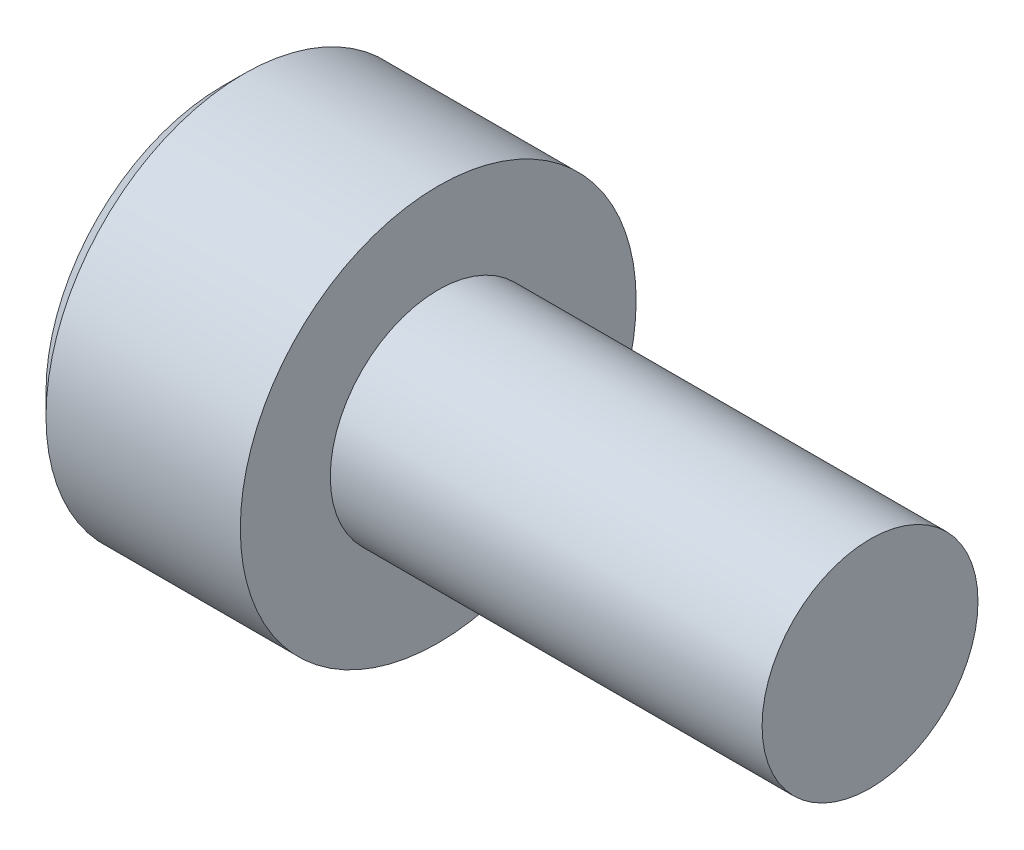
ISO-10303-21;
HEADER;
FILE_DESCRIPTION(('STEP AP214'),'2;1');
FILE_NAME('part.step','',(''),(''),'','','');
FILE_SCHEMA(('AUTOMOTIVE_DESIGN { 1 0 10303 214 1 1 1 1 }'));
ENDSEC;
DATA;
#1=APPLICATION_CONTEXT('core data for automotive mechanical design processes');
#2=APPLICATION_PROTOCOL_DEFINITION('international standard','automotive_design',2000,#1);
#3=PRODUCT_CONTEXT('',#1,'mechanical');
#4=PRODUCT('Part','Part','',(#3));
#5=PRODUCT_RELATED_PRODUCT_CATEGORY('part','',(#4));
#6=PRODUCT_DEFINITION_FORMATION('','',#4);
#7=PRODUCT_DEFINITION_CONTEXT('part definition',#1,'design');
#8=PRODUCT_DEFINITION('design','',#6,#7);
#9=PRODUCT_DEFINITION_SHAPE('','',#8);
#10=(LENGTH_UNIT() NAMED_UNIT(*) SI_UNIT(.MILLI.,.METRE.));
#11=(NAMED_UNIT(*) PLANE_ANGLE_UNIT() SI_UNIT($,.RADIAN.));
#12=(NAMED_UNIT(*) SI_UNIT($,.STERADIAN.) SOLID_ANGLE_UNIT());
#13=UNCERTAINTY_MEASURE_WITH_UNIT(LENGTH_MEASURE(1.E-05),#10,'distance_accuracy_value','');
#14=(GEOMETRIC_REPRESENTATION_CONTEXT(3) GLOBAL_UNCERTAINTY_ASSIGNED_CONTEXT((#13)) GLOBAL_UNIT_ASSIGNED_CONTEXT((#10,
#11,#12)) REPRESENTATION_CONTEXT('',''));
#15=CARTESIAN_POINT('',(0.,0.,0.));
#16=DIRECTION('',(0.,0.,1.));
#17=DIRECTION('',(1.,0.,0.));
#18=AXIS2_PLACEMENT_3D('',#15,#16,#17);
#19=CARTESIAN_POINT('',(-3.,0.,0.));
#20=DIRECTION('',(1.,0.,0.));
#21=DIRECTION('',(0.,1.,0.));
#22=AXIS2_PLACEMENT_3D('',#19,#20,#21);
#23=PLANE('',#22);
#24=CARTESIAN_POINT('',(-3.,0.,0.));
#25=DIRECTION('',(1.,0.,0.));
#26=DIRECTION('',(0.,1.,0.));
#27=AXIS2_PLACEMENT_3D('',#24,#25,#26);
#28=CIRCLE('',#27,2.45);
#29=CARTESIAN_POINT('',(-3.,2.45,0.));
#30=VERTEX_POINT('',#29);
#31=EDGE_CURVE('E53',#30,#30,#28,.F.);
#32=ORIENTED_EDGE('',*,*,#31,.T.);
#33=EDGE_LOOP('',(#32));
#34=FACE_BOUND('',#33,.T.);
#35=DIRECTION('',(0.,0.5,-0.866025403784439));
#36=VECTOR('',#35,1.);
#37=CARTESIAN_POINT('',(-3.,0.721687836487032,1.25));
#38=LINE('',#37,#36);
#39=CARTESIAN_POINT('',(-3.,0.721687836487031,1.25));
#40=VERTEX_POINT('',#39);
#41=CARTESIAN_POINT('',(-3.,1.44337567297406,0.));
#42=VERTEX_POINT('',#41);
#43=EDGE_CURVE('E189',#40,#42,#38,.T.);
#44=ORIENTED_EDGE('',*,*,#43,.F.);
#45=DIRECTION('',(0.,1.,0.));
#46=VECTOR('',#45,1.);
#47=CARTESIAN_POINT('',(-3.,-0.721687836487034,1.25));
#48=LINE('',#47,#46);
#49=CARTESIAN_POINT('',(-3.,-0.721687836487034,1.25));
#50=VERTEX_POINT('',#49);
#51=EDGE_CURVE('E151',#50,#40,#48,.T.);
#52=ORIENTED_EDGE('',*,*,#51,.F.);
#53=DIRECTION('',(0.,0.5,0.866025403784439));
#54=VECTOR('',#53,1.);
#55=CARTESIAN_POINT('',(-3.,-1.44337567297407,0.));
#56=LINE('',#55,#54);
#57=CARTESIAN_POINT('',(-3.,-1.44337567297407,0.));
#58=VERTEX_POINT('',#57);
#59=EDGE_CURVE('E147',#58,#50,#56,.T.);
#60=ORIENTED_EDGE('',*,*,#59,.F.);
#61=DIRECTION('',(0.,-0.5,0.866025403784439));
#62=VECTOR('',#61,1.);
#63=CARTESIAN_POINT('',(-3.,-0.721687836487033,-1.25));
#64=LINE('',#63,#62);
#65=CARTESIAN_POINT('',(-3.,-0.721687836487033,-1.25));
#66=VERTEX_POINT('',#65);
#67=EDGE_CURVE('E198',#66,#58,#64,.T.);
#68=ORIENTED_EDGE('',*,*,#67,.F.);
#69=DIRECTION('',(0.,-1.,0.));
#70=VECTOR('',#69,1.);
#71=CARTESIAN_POINT('',(-3.,0.721687836487032,-1.25));
#72=LINE('',#71,#70);
#73=CARTESIAN_POINT('',(-3.,0.721687836487032,-1.25));
#74=VERTEX_POINT('',#73);
#75=EDGE_CURVE('E195',#74,#66,#72,.T.);
#76=ORIENTED_EDGE('',*,*,#75,.F.);
#77=DIRECTION('',(0.,-0.5,-0.866025403784439));
#78=VECTOR('',#77,1.);
#79=CARTESIAN_POINT('',(-3.,1.44337567297406,0.));
#80=LINE('',#79,#78);
#81=EDGE_CURVE('E192',#42,#74,#80,.T.);
#82=ORIENTED_EDGE('',*,*,#81,.F.);
#83=EDGE_LOOP('',(#44,#52,#60,#68,#76,#82));
#84=FACE_BOUND('',#83,.T.);
#85=ADVANCED_FACE('F44',(#34,#84),#23,.F.);
#86=CARTESIAN_POINT('',(0.,1.5,0.));
#87=DIRECTION('',(-1.,0.,0.));
#88=DIRECTION('',(0.,-1.,0.));
#89=AXIS2_PLACEMENT_3D('',#86,#87,#88);
#90=PLANE('',#89);
#91=CARTESIAN_POINT('',(0.,0.,0.));
#92=DIRECTION('',(-1.,0.,0.));
#93=DIRECTION('',(0.,-1.,0.));
#94=AXIS2_PLACEMENT_3D('',#91,#92,#93);
#95=CIRCLE('',#94,2.75);
#96=CARTESIAN_POINT('',(0.,-2.75,0.));
#97=VERTEX_POINT('',#96);
#98=EDGE_CURVE('E234',#97,#97,#95,.T.);
#99=ORIENTED_EDGE('',*,*,#98,.F.);
#100=EDGE_LOOP('',(#99));
#101=FACE_BOUND('',#100,.T.);
#102=CARTESIAN_POINT('',(0.,0.,0.));
#103=DIRECTION('',(-1.,0.,0.));
#104=DIRECTION('',(0.,-1.,0.));
#105=AXIS2_PLACEMENT_3D('',#102,#103,#104);
#106=CIRCLE('',#105,1.5);
#107=CARTESIAN_POINT('',(0.,-1.5,0.));
#108=VERTEX_POINT('',#107);
#109=EDGE_CURVE('E226',#108,#108,#106,.T.);
#110=ORIENTED_EDGE('',*,*,#109,.T.);
#111=EDGE_LOOP('',(#110));
#112=FACE_BOUND('',#111,.T.);
#113=ADVANCED_FACE('F253',(#101,#112),#90,.F.);
#114=CARTESIAN_POINT('',(-3.,0.,0.));
#115=DIRECTION('',(-1.,0.,0.));
#116=DIRECTION('',(0.,-1.,0.));
#117=AXIS2_PLACEMENT_3D('',#114,#115,#116);
#118=CYLINDRICAL_SURFACE('',#117,2.75);
#119=CARTESIAN_POINT('',(-2.7,0.,0.));
#120=DIRECTION('',(1.,0.,0.));
#121=DIRECTION('',(0.,1.,0.));
#122=AXIS2_PLACEMENT_3D('',#119,#120,#121);
#123=CIRCLE('',#122,2.75);
#124=CARTESIAN_POINT('',(-2.7,2.75,0.));
#125=VERTEX_POINT('',#124);
#126=EDGE_CURVE('E11',#125,#125,#123,.T.);
#127=ORIENTED_EDGE('',*,*,#126,.T.);
#128=EDGE_LOOP('',(#127));
#129=FACE_BOUND('',#128,.T.);
#130=ORIENTED_EDGE('',*,*,#98,.T.);
#131=EDGE_LOOP('',(#130));
#132=FACE_BOUND('',#131,.T.);
#133=ADVANCED_FACE('F258',(#129,#132),#118,.T.);
#134=CARTESIAN_POINT('',(6.,1.5,0.));
#135=DIRECTION('',(-1.,0.,0.));
#136=DIRECTION('',(0.,-1.,0.));
#137=AXIS2_PLACEMENT_3D('',#134,#135,#136);
#138=PLANE('',#137);
#139=CARTESIAN_POINT('',(6.,0.,0.));
#140=DIRECTION('',(-1.,0.,0.));
#141=DIRECTION('',(0.,-1.,0.));
#142=AXIS2_PLACEMENT_3D('',#139,#140,#141);
#143=CIRCLE('',#142,1.5);
#144=CARTESIAN_POINT('',(6.,-1.5,0.));
#145=VERTEX_POINT('',#144);
#146=EDGE_CURVE('E230',#145,#145,#143,.T.);
#147=ORIENTED_EDGE('',*,*,#146,.F.);
#148=EDGE_LOOP('',(#147));
#149=FACE_BOUND('',#148,.T.);
#150=ADVANCED_FACE('F262',(#149),#138,.F.);
#151=CARTESIAN_POINT('',(-3.,0.,0.));
#152=DIRECTION('',(-1.,0.,0.));
#153=DIRECTION('',(0.,-1.,0.));
#154=AXIS2_PLACEMENT_3D('',#151,#152,#153);
#155=CYLINDRICAL_SURFACE('',#154,1.5);
#156=ORIENTED_EDGE('',*,*,#109,.F.);
#157=EDGE_LOOP('',(#156));
#158=FACE_BOUND('',#157,.T.);
#159=ORIENTED_EDGE('',*,*,#146,.T.);
#160=EDGE_LOOP('',(#159));
#161=FACE_BOUND('',#160,.T.);
#162=ADVANCED_FACE('F269',(#158,#161),#155,.T.);
#163=CARTESIAN_POINT('',(-1.7,-0.721687836487034,1.25));
#164=DIRECTION('',(0.,0.,1.));
#165=DIRECTION('',(0.,-1.,0.));
#166=AXIS2_PLACEMENT_3D('',#163,#164,#165);
#167=PLANE('',#166);
#168=DIRECTION('',(0.,1.,0.));
#169=VECTOR('',#168,1.);
#170=CARTESIAN_POINT('',(-1.7,-0.721687836487034,1.25));
#171=LINE('',#170,#169);
#172=CARTESIAN_POINT('',(-1.7,-0.721687836487034,1.25));
#173=VERTEX_POINT('',#172);
#174=CARTESIAN_POINT('',(-1.7,0.,1.25));
#175=VERTEX_POINT('',#174);
#176=EDGE_CURVE('E73',#173,#175,#171,.T.);
#177=ORIENTED_EDGE('',*,*,#176,.F.);
#178=DIRECTION('',(-1.,0.,0.));
#179=VECTOR('',#178,1.);
#180=CARTESIAN_POINT('',(-1.7,-0.721687836487034,1.25));
#181=LINE('',#180,#179);
#182=EDGE_CURVE('E204',#173,#50,#181,.T.);
#183=ORIENTED_EDGE('',*,*,#182,.T.);
#184=ORIENTED_EDGE('',*,*,#51,.T.);
#185=DIRECTION('',(-1.,0.,0.));
#186=VECTOR('',#185,1.);
#187=CARTESIAN_POINT('',(-1.7,0.721687836487032,1.25));
#188=LINE('',#187,#186);
#189=CARTESIAN_POINT('',(-1.7,0.721687836487032,1.25));
#190=VERTEX_POINT('',#189);
#191=EDGE_CURVE('E62',#190,#40,#188,.T.);
#192=ORIENTED_EDGE('',*,*,#191,.F.);
#193=EDGE_CURVE('E139',#175,#190,#171,.T.);
#194=ORIENTED_EDGE('',*,*,#193,.F.);
#195=EDGE_LOOP('',(#177,#183,#184,#192,#194));
#196=FACE_BOUND('',#195,.T.);
#197=ADVANCED_FACE('F149',(#196),#167,.F.);
#198=CARTESIAN_POINT('',(-1.7,-1.44337567297407,0.));
#199=DIRECTION('',(0.,-0.866025403784439,0.5));
#200=DIRECTION('',(0.,-0.5,-0.866025403784439));
#201=AXIS2_PLACEMENT_3D('',#198,#199,#200);
#202=PLANE('',#201);
#203=DIRECTION('',(0.,0.5,0.866025403784439));
#204=VECTOR('',#203,1.);
#205=CARTESIAN_POINT('',(-1.7,-1.44337567297407,0.));
#206=LINE('',#205,#204);
#207=CARTESIAN_POINT('',(-1.7,-1.44337567297407,0.));
#208=VERTEX_POINT('',#207);
#209=CARTESIAN_POINT('',(-1.7,-1.08253175473055,0.625000000000001));
#210=VERTEX_POINT('',#209);
#211=EDGE_CURVE('E155',#208,#210,#206,.T.);
#212=ORIENTED_EDGE('',*,*,#211,.F.);
#213=DIRECTION('',(-1.,0.,0.));
#214=VECTOR('',#213,1.);
#215=CARTESIAN_POINT('',(-1.7,-1.44337567297407,0.));
#216=LINE('',#215,#214);
#217=EDGE_CURVE('E208',#208,#58,#216,.T.);
#218=ORIENTED_EDGE('',*,*,#217,.T.);
#219=ORIENTED_EDGE('',*,*,#59,.T.);
#220=ORIENTED_EDGE('',*,*,#182,.F.);
#221=EDGE_CURVE('E183',#210,#173,#206,.T.);
#222=ORIENTED_EDGE('',*,*,#221,.F.);
#223=EDGE_LOOP('',(#212,#218,#219,#220,#222));
#224=FACE_BOUND('',#223,.T.);
#225=ADVANCED_FACE('F282',(#224),#202,.F.);
#226=CARTESIAN_POINT('',(-1.7,-0.721687836487033,-1.25));
#227=DIRECTION('',(0.,-0.866025403784439,-0.5));
#228=DIRECTION('',(0.,0.5,-0.866025403784439));
#229=AXIS2_PLACEMENT_3D('',#226,#227,#228);
#230=PLANE('',#229);
#231=DIRECTION('',(0.,-0.5,0.866025403784439));
#232=VECTOR('',#231,1.);
#233=CARTESIAN_POINT('',(-1.7,-0.721687836487033,-1.25));
#234=LINE('',#233,#232);
#235=CARTESIAN_POINT('',(-1.7,-0.721687836487033,-1.25));
#236=VERTEX_POINT('',#235);
#237=CARTESIAN_POINT('',(-1.7,-1.08253175473055,-0.625));
#238=VERTEX_POINT('',#237);
#239=EDGE_CURVE('E179',#236,#238,#234,.T.);
#240=ORIENTED_EDGE('',*,*,#239,.F.);
#241=DIRECTION('',(-1.,0.,0.));
#242=VECTOR('',#241,1.);
#243=CARTESIAN_POINT('',(-1.7,-0.721687836487033,-1.25));
#244=LINE('',#243,#242);
#245=EDGE_CURVE('E212',#236,#66,#244,.T.);
#246=ORIENTED_EDGE('',*,*,#245,.T.);
#247=ORIENTED_EDGE('',*,*,#67,.T.);
#248=ORIENTED_EDGE('',*,*,#217,.F.);
#249=EDGE_CURVE('E178',#238,#208,#234,.T.);
#250=ORIENTED_EDGE('',*,*,#249,.F.);
#251=EDGE_LOOP('',(#240,#246,#247,#248,#250));
#252=FACE_BOUND('',#251,.T.);
#253=ADVANCED_FACE('F294',(#252),#230,.F.);
#254=CARTESIAN_POINT('',(-1.7,0.721687836487032,-1.25));
#255=DIRECTION('',(0.,0.,-1.));
#256=DIRECTION('',(-1.,0.,0.));
#257=AXIS2_PLACEMENT_3D('',#254,#255,#256);
#258=PLANE('',#257);
#259=DIRECTION('',(0.,-1.,0.));
#260=VECTOR('',#259,1.);
#261=CARTESIAN_POINT('',(-1.7,0.721687836487032,-1.25));
#262=LINE('',#261,#260);
#263=CARTESIAN_POINT('',(-1.7,0.721687836487032,-1.25));
#264=VERTEX_POINT('',#263);
#265=CARTESIAN_POINT('',(-1.7,0.,-1.25));
#266=VERTEX_POINT('',#265);
#267=EDGE_CURVE('E174',#264,#266,#262,.T.);
#268=ORIENTED_EDGE('',*,*,#267,.F.);
#269=DIRECTION('',(-1.,0.,0.));
#270=VECTOR('',#269,1.);
#271=CARTESIAN_POINT('',(-1.7,0.721687836487032,-1.25));
#272=LINE('',#271,#270);
#273=EDGE_CURVE('E216',#264,#74,#272,.T.);
#274=ORIENTED_EDGE('',*,*,#273,.T.);
#275=ORIENTED_EDGE('',*,*,#75,.T.);
#276=ORIENTED_EDGE('',*,*,#245,.F.);
#277=EDGE_CURVE('E173',#266,#236,#262,.T.);
#278=ORIENTED_EDGE('',*,*,#277,.F.);
#279=EDGE_LOOP('',(#268,#274,#275,#276,#278));
#280=FACE_BOUND('',#279,.T.);
#281=ADVANCED_FACE('F290',(#280),#258,.F.);
#282=CARTESIAN_POINT('',(-1.7,1.44337567297406,0.));
#283=DIRECTION('',(0.,0.866025403784439,-0.5));
#284=DIRECTION('',(0.,0.5,0.866025403784439));
#285=AXIS2_PLACEMENT_3D('',#282,#283,#284);
#286=PLANE('',#285);
#287=DIRECTION('',(0.,-0.5,-0.866025403784439));
#288=VECTOR('',#287,1.);
#289=CARTESIAN_POINT('',(-1.7,1.44337567297406,0.));
#290=LINE('',#289,#288);
#291=CARTESIAN_POINT('',(-1.7,1.44337567297406,0.));
#292=VERTEX_POINT('',#291);
#293=CARTESIAN_POINT('',(-1.7,1.08253175473055,-0.625));
#294=VERTEX_POINT('',#293);
#295=EDGE_CURVE('E167',#292,#294,#290,.T.);
#296=ORIENTED_EDGE('',*,*,#295,.F.);
#297=DIRECTION('',(-1.,0.,0.));
#298=VECTOR('',#297,1.);
#299=CARTESIAN_POINT('',(-1.7,1.44337567297406,0.));
#300=LINE('',#299,#298);
#301=EDGE_CURVE('E154',#292,#42,#300,.T.);
#302=ORIENTED_EDGE('',*,*,#301,.T.);
#303=ORIENTED_EDGE('',*,*,#81,.T.);
#304=ORIENTED_EDGE('',*,*,#273,.F.);
#305=EDGE_CURVE('E162',#294,#264,#290,.T.);
#306=ORIENTED_EDGE('',*,*,#305,.F.);
#307=EDGE_LOOP('',(#296,#302,#303,#304,#306));
#308=FACE_BOUND('',#307,.T.);
#309=ADVANCED_FACE('F287',(#308),#286,.F.);
#310=CARTESIAN_POINT('',(-1.7,0.721687836487032,1.25));
#311=DIRECTION('',(0.,0.866025403784439,0.5));
#312=DIRECTION('',(0.,-0.5,0.866025403784439));
#313=AXIS2_PLACEMENT_3D('',#310,#311,#312);
#314=PLANE('',#313);
#315=DIRECTION('',(0.,0.5,-0.866025403784439));
#316=VECTOR('',#315,1.);
#317=CARTESIAN_POINT('',(-1.7,0.721687836487032,1.25));
#318=LINE('',#317,#316);
#319=CARTESIAN_POINT('',(-1.7,1.08253175473055,0.625));
#320=VERTEX_POINT('',#319);
#321=EDGE_CURVE('E141',#190,#320,#318,.T.);
#322=ORIENTED_EDGE('',*,*,#321,.F.);
#323=ORIENTED_EDGE('',*,*,#191,.T.);
#324=ORIENTED_EDGE('',*,*,#43,.T.);
#325=ORIENTED_EDGE('',*,*,#301,.F.);
#326=EDGE_CURVE('E160',#320,#292,#318,.T.);
#327=ORIENTED_EDGE('',*,*,#326,.F.);
#328=EDGE_LOOP('',(#322,#323,#324,#325,#327));
#329=FACE_BOUND('',#328,.T.);
#330=ADVANCED_FACE('F158',(#329),#314,.F.);
#331=CARTESIAN_POINT('',(-1.7,0.,0.));
#332=DIRECTION('',(-1.,0.,0.));
#333=DIRECTION('',(0.,0.,1.));
#334=AXIS2_PLACEMENT_3D('',#331,#332,#333);
#335=PLANE('',#334);
#336=ORIENTED_EDGE('',*,*,#193,.T.);
#337=ORIENTED_EDGE('',*,*,#321,.T.);
#338=CARTESIAN_POINT('',(-1.7,0.,0.));
#339=DIRECTION('',(-1.,0.,0.));
#340=DIRECTION('',(0.,-1.,0.));
#341=AXIS2_PLACEMENT_3D('',#338,#339,#340);
#342=CIRCLE('',#341,1.25);
#343=EDGE_CURVE('E143',#175,#320,#342,.T.);
#344=ORIENTED_EDGE('',*,*,#343,.F.);
#345=EDGE_LOOP('',(#336,#337,#344));
#346=FACE_BOUND('',#345,.T.);
#347=ADVANCED_FACE('F140',(#346),#335,.T.);
#348=ORIENTED_EDGE('',*,*,#326,.T.);
#349=ORIENTED_EDGE('',*,*,#295,.T.);
#350=EDGE_CURVE('E322',#320,#294,#342,.T.);
#351=ORIENTED_EDGE('',*,*,#350,.F.);
#352=EDGE_LOOP('',(#348,#349,#351));
#353=FACE_BOUND('',#352,.T.);
#354=ADVANCED_FACE('F310',(#353),#335,.T.);
#355=ORIENTED_EDGE('',*,*,#305,.T.);
#356=ORIENTED_EDGE('',*,*,#267,.T.);
#357=EDGE_CURVE('E328',#294,#266,#342,.T.);
#358=ORIENTED_EDGE('',*,*,#357,.F.);
#359=EDGE_LOOP('',(#355,#356,#358));
#360=FACE_BOUND('',#359,.T.);
#361=ADVANCED_FACE('F314',(#360),#335,.T.);
#362=ORIENTED_EDGE('',*,*,#277,.T.);
#363=ORIENTED_EDGE('',*,*,#239,.T.);
#364=EDGE_CURVE('E331',#266,#238,#342,.T.);
#365=ORIENTED_EDGE('',*,*,#364,.F.);
#366=EDGE_LOOP('',(#362,#363,#365));
#367=FACE_BOUND('',#366,.T.);
#368=ADVANCED_FACE('F307',(#367),#335,.T.);
#369=ORIENTED_EDGE('',*,*,#249,.T.);
#370=ORIENTED_EDGE('',*,*,#211,.T.);
#371=EDGE_CURVE('E207',#238,#210,#342,.T.);
#372=ORIENTED_EDGE('',*,*,#371,.F.);
#373=EDGE_LOOP('',(#369,#370,#372));
#374=FACE_BOUND('',#373,.T.);
#375=ADVANCED_FACE('F303',(#374),#335,.T.);
#376=ORIENTED_EDGE('',*,*,#221,.T.);
#377=ORIENTED_EDGE('',*,*,#176,.T.);
#378=EDGE_CURVE('E223',#210,#175,#342,.T.);
#379=ORIENTED_EDGE('',*,*,#378,.F.);
#380=EDGE_LOOP('',(#376,#377,#379));
#381=FACE_BOUND('',#380,.T.);
#382=ADVANCED_FACE('F248',(#381),#335,.T.);
#383=CARTESIAN_POINT('',(-0.948924226215541,0.,0.));
#384=DIRECTION('',(-1.,0.,0.));
#385=DIRECTION('',(0.,-1.,0.));
#386=AXIS2_PLACEMENT_3D('',#383,#384,#385);
#387=CONICAL_SURFACE('',#386,0.,1.02974425867665);
#388=ORIENTED_EDGE('',*,*,#378,.T.);
#389=ORIENTED_EDGE('',*,*,#343,.T.);
#390=ORIENTED_EDGE('',*,*,#350,.T.);
#391=ORIENTED_EDGE('',*,*,#357,.T.);
#392=ORIENTED_EDGE('',*,*,#364,.T.);
#393=ORIENTED_EDGE('',*,*,#371,.T.);
#394=EDGE_LOOP('',(#388,#389,#390,#391,#392,#393));
#395=FACE_BOUND('',#394,.T.);
#396=CARTESIAN_POINT('',(-0.948924226215541,0.,0.));
#397=VERTEX_POINT('',#396);
#398=VERTEX_LOOP('',#397);
#399=FACE_BOUND('',#398,.T.);
#400=ADVANCED_FACE('F243',(#395,#399),#387,.F.);
#401=CARTESIAN_POINT('',(-3.,0.,0.));
#402=DIRECTION('',(1.,0.,0.));
#403=DIRECTION('',(0.,1.,0.));
#404=AXIS2_PLACEMENT_3D('',#401,#402,#403);
#405=CONICAL_SURFACE('',#404,2.45,0.78539816339745);
#406=ORIENTED_EDGE('',*,*,#126,.F.);
#407=EDGE_LOOP('',(#406));
#408=FACE_BOUND('',#407,.T.);
#409=ORIENTED_EDGE('',*,*,#31,.F.);
#410=EDGE_LOOP('',(#409));
#411=FACE_BOUND('',#410,.T.);
#412=ADVANCED_FACE('F46',(#408,#411),#405,.T.);
#413=CLOSED_SHELL('',(#85,#113,#133,#150,#162,#197,#225,#253,#281,#309,#330,#347,#354,#361,#368,
#375,#382,#400,#412));
#414=MANIFOLD_SOLID_BREP('B2',#413);
#415=ADVANCED_BREP_SHAPE_REPRESENTATION('',(#18,#414),#14);
#416=SHAPE_DEFINITION_REPRESENTATION(#9,#415);
ENDSEC;
END-ISO-10303-21;
